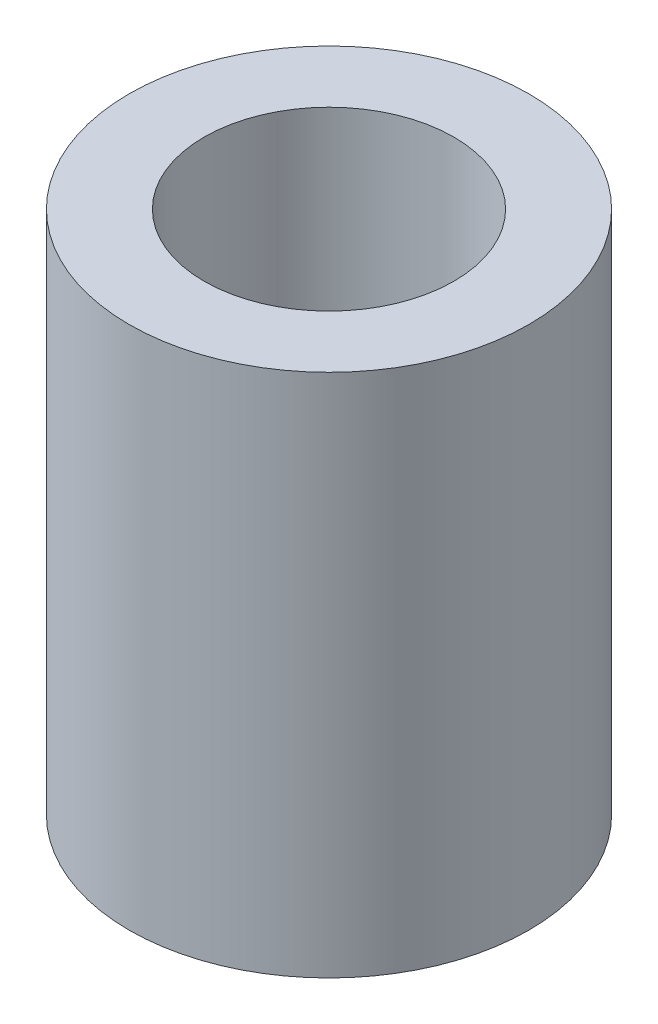
ISO-10303-21;
HEADER;
FILE_DESCRIPTION(('STEP AP214'),'2;1');
FILE_NAME('part.step','',(''),(''),'','','');
FILE_SCHEMA(('AUTOMOTIVE_DESIGN { 1 0 10303 214 1 1 1 1 }'));
ENDSEC;
DATA;
#1=APPLICATION_CONTEXT('core data for automotive mechanical design processes');
#2=APPLICATION_PROTOCOL_DEFINITION('international standard','automotive_design',2000,#1);
#3=PRODUCT_CONTEXT('',#1,'mechanical');
#4=PRODUCT('Part','Part','',(#3));
#5=PRODUCT_RELATED_PRODUCT_CATEGORY('part','',(#4));
#6=PRODUCT_DEFINITION_FORMATION('','',#4);
#7=PRODUCT_DEFINITION_CONTEXT('part definition',#1,'design');
#8=PRODUCT_DEFINITION('design','',#6,#7);
#9=PRODUCT_DEFINITION_SHAPE('','',#8);
#10=(LENGTH_UNIT() NAMED_UNIT(*) SI_UNIT(.MILLI.,.METRE.));
#11=(NAMED_UNIT(*) PLANE_ANGLE_UNIT() SI_UNIT($,.RADIAN.));
#12=(NAMED_UNIT(*) SI_UNIT($,.STERADIAN.) SOLID_ANGLE_UNIT());
#13=UNCERTAINTY_MEASURE_WITH_UNIT(LENGTH_MEASURE(1.E-05),#10,'distance_accuracy_value','');
#14=(GEOMETRIC_REPRESENTATION_CONTEXT(3) GLOBAL_UNCERTAINTY_ASSIGNED_CONTEXT((#13)) GLOBAL_UNIT_ASSIGNED_CONTEXT((#10,
#11,#12)) REPRESENTATION_CONTEXT('',''));
#15=CARTESIAN_POINT('',(0.,0.,0.));
#16=DIRECTION('',(0.,0.,1.));
#17=DIRECTION('',(1.,0.,0.));
#18=AXIS2_PLACEMENT_3D('',#15,#16,#17);
#19=CARTESIAN_POINT('',(0.,42.,0.));
#20=DIRECTION('',(0.,1.,0.));
#21=DIRECTION('',(0.,0.,1.));
#22=AXIS2_PLACEMENT_3D('',#19,#20,#21);
#23=PLANE('',#22);
#24=CARTESIAN_POINT('',(0.,42.,0.));
#25=DIRECTION('',(0.,1.,0.));
#26=DIRECTION('',(0.,0.,1.));
#27=AXIS2_PLACEMENT_3D('',#24,#25,#26);
#28=CIRCLE('',#27,16.);
#29=CARTESIAN_POINT('',(0.,42.,-16.));
#30=VERTEX_POINT('',#29);
#31=EDGE_CURVE('E10',#30,#30,#28,.T.);
#32=ORIENTED_EDGE('',*,*,#31,.T.);
#33=EDGE_LOOP('',(#32));
#34=FACE_BOUND('',#33,.T.);
#35=CARTESIAN_POINT('',(0.,42.,0.));
#36=DIRECTION('',(0.,1.,0.));
#37=DIRECTION('',(0.,0.,1.));
#38=AXIS2_PLACEMENT_3D('',#35,#36,#37);
#39=CIRCLE('',#38,10.);
#40=CARTESIAN_POINT('',(0.,42.,-10.));
#41=VERTEX_POINT('',#40);
#42=EDGE_CURVE('E41',#41,#41,#39,.T.);
#43=ORIENTED_EDGE('',*,*,#42,.F.);
#44=EDGE_LOOP('',(#43));
#45=FACE_BOUND('',#44,.T.);
#46=ADVANCED_FACE('F30',(#34,#45),#23,.T.);
#47=CARTESIAN_POINT('',(0.,0.,0.));
#48=DIRECTION('',(0.,1.,0.));
#49=DIRECTION('',(0.,0.,1.));
#50=AXIS2_PLACEMENT_3D('',#47,#48,#49);
#51=PLANE('',#50);
#52=CARTESIAN_POINT('',(0.,0.,0.));
#53=DIRECTION('',(0.,1.,0.));
#54=DIRECTION('',(0.,0.,1.));
#55=AXIS2_PLACEMENT_3D('',#52,#53,#54);
#56=CIRCLE('',#55,16.);
#57=CARTESIAN_POINT('',(0.,0.,-16.));
#58=VERTEX_POINT('',#57);
#59=EDGE_CURVE('E34',#58,#58,#56,.T.);
#60=ORIENTED_EDGE('',*,*,#59,.F.);
#61=EDGE_LOOP('',(#60));
#62=FACE_BOUND('',#61,.T.);
#63=CARTESIAN_POINT('',(0.,0.,0.));
#64=DIRECTION('',(0.,1.,0.));
#65=DIRECTION('',(0.,0.,1.));
#66=AXIS2_PLACEMENT_3D('',#63,#64,#65);
#67=CIRCLE('',#66,10.);
#68=CARTESIAN_POINT('',(0.,0.,-10.));
#69=VERTEX_POINT('',#68);
#70=EDGE_CURVE('E43',#69,#69,#67,.T.);
#71=ORIENTED_EDGE('',*,*,#70,.T.);
#72=EDGE_LOOP('',(#71));
#73=FACE_BOUND('',#72,.T.);
#74=ADVANCED_FACE('F53',(#62,#73),#51,.F.);
#75=CARTESIAN_POINT('',(0.,42.,0.));
#76=DIRECTION('',(0.,-1.,0.));
#77=DIRECTION('',(0.,0.,-1.));
#78=AXIS2_PLACEMENT_3D('',#75,#76,#77);
#79=CYLINDRICAL_SURFACE('',#78,16.);
#80=CARTESIAN_POINT('',(0.,42.,-16.));
#81=CARTESIAN_POINT('',(0.,41.5625,-16.));
#82=CARTESIAN_POINT('',(0.,41.125,-16.));
#83=CARTESIAN_POINT('',(0.,40.25,-16.));
#84=CARTESIAN_POINT('',(0.,39.8125,-16.));
#85=CARTESIAN_POINT('',(0.,38.9375,-16.));
#86=CARTESIAN_POINT('',(0.,38.5,-16.));
#87=CARTESIAN_POINT('',(0.,37.625,-16.));
#88=CARTESIAN_POINT('',(0.,37.1875,-16.));
#89=CARTESIAN_POINT('',(0.,36.3125,-16.));
#90=CARTESIAN_POINT('',(0.,35.875,-16.));
#91=CARTESIAN_POINT('',(0.,35.,-16.));
#92=CARTESIAN_POINT('',(0.,34.5625,-16.));
#93=CARTESIAN_POINT('',(0.,33.6875,-16.));
#94=CARTESIAN_POINT('',(0.,33.25,-16.));
#95=CARTESIAN_POINT('',(0.,32.375,-16.));
#96=CARTESIAN_POINT('',(0.,31.9375,-16.));
#97=CARTESIAN_POINT('',(0.,31.0625,-16.));
#98=CARTESIAN_POINT('',(0.,30.625,-16.));
#99=CARTESIAN_POINT('',(0.,29.75,-16.));
#100=CARTESIAN_POINT('',(0.,29.3125,-16.));
#101=CARTESIAN_POINT('',(0.,28.4375,-16.));
#102=CARTESIAN_POINT('',(0.,28.,-16.));
#103=CARTESIAN_POINT('',(0.,27.125,-16.));
#104=CARTESIAN_POINT('',(0.,26.6875,-16.));
#105=CARTESIAN_POINT('',(0.,25.8125,-16.));
#106=CARTESIAN_POINT('',(0.,25.375,-16.));
#107=CARTESIAN_POINT('',(0.,24.5,-16.));
#108=CARTESIAN_POINT('',(0.,24.0625,-16.));
#109=CARTESIAN_POINT('',(0.,23.1875,-16.));
#110=CARTESIAN_POINT('',(0.,22.75,-16.));
#111=CARTESIAN_POINT('',(0.,21.875,-16.));
#112=CARTESIAN_POINT('',(0.,21.4375,-16.));
#113=CARTESIAN_POINT('',(0.,20.5625,-16.));
#114=CARTESIAN_POINT('',(0.,20.125,-16.));
#115=CARTESIAN_POINT('',(0.,19.25,-16.));
#116=CARTESIAN_POINT('',(0.,18.8125,-16.));
#117=CARTESIAN_POINT('',(0.,17.9375,-16.));
#118=CARTESIAN_POINT('',(0.,17.5,-16.));
#119=CARTESIAN_POINT('',(0.,16.625,-16.));
#120=CARTESIAN_POINT('',(0.,16.1875,-16.));
#121=CARTESIAN_POINT('',(0.,15.3125,-16.));
#122=CARTESIAN_POINT('',(0.,14.875,-16.));
#123=CARTESIAN_POINT('',(0.,14.,-16.));
#124=CARTESIAN_POINT('',(0.,13.5625,-16.));
#125=CARTESIAN_POINT('',(0.,12.6875,-16.));
#126=CARTESIAN_POINT('',(0.,12.25,-16.));
#127=CARTESIAN_POINT('',(0.,11.375,-16.));
#128=CARTESIAN_POINT('',(0.,10.9375,-16.));
#129=CARTESIAN_POINT('',(0.,10.0625,-16.));
#130=CARTESIAN_POINT('',(0.,9.625,-16.));
#131=CARTESIAN_POINT('',(0.,8.75,-16.));
#132=CARTESIAN_POINT('',(0.,8.3125,-16.));
#133=CARTESIAN_POINT('',(0.,7.4375,-16.));
#134=CARTESIAN_POINT('',(0.,7.,-16.));
#135=CARTESIAN_POINT('',(0.,6.125,-16.));
#136=CARTESIAN_POINT('',(0.,5.6875,-16.));
#137=CARTESIAN_POINT('',(0.,4.8125,-16.));
#138=CARTESIAN_POINT('',(0.,4.375,-16.));
#139=CARTESIAN_POINT('',(0.,3.5,-16.));
#140=CARTESIAN_POINT('',(0.,3.0625,-16.));
#141=CARTESIAN_POINT('',(0.,2.1875,-16.));
#142=CARTESIAN_POINT('',(0.,1.75,-16.));
#143=CARTESIAN_POINT('',(0.,0.875000000000001,-16.));
#144=CARTESIAN_POINT('',(0.,0.4375,-16.));
#145=CARTESIAN_POINT('',(0.,0.,-16.));
#146=B_SPLINE_CURVE_WITH_KNOTS('',3,(#80,#81,#82,#83,#84,#85,#86,#87,#88,#89,#90,#91,#92,#93,
#94,#95,#96,#97,#98,#99,#100,#101,#102,#103,#104,#105,#106,#107,#108,#109,#110,#111,#112,#113,
#114,#115,#116,#117,#118,#119,#120,#121,#122,#123,#124,#125,#126,#127,#128,#129,#130,#131,#132,
#133,#134,#135,#136,#137,#138,#139,#140,#141,#142,#143,#144,#145),.UNSPECIFIED.,.F.,.F.,(4,2,2,
2,2,2,2,2,2,2,2,2,2,2,2,2,2,2,2,2,2,2,2,2,2,2,2,2,2,2,2,2,4),(0.,1.31249999999999,2.625,3.9375,
5.25,6.5625,7.87499999999999,9.18749999999999,10.5,11.8125,13.125,14.4375,15.75,17.0625,18.375,
19.6875,21.,22.3125,23.625,24.9375,26.25,27.5625,28.875,30.1875,31.5,32.8125,34.125,35.4375,
36.75,38.0625,39.375,40.6875,42.),.UNSPECIFIED.);
#147=EDGE_CURVE('BSEAM32',#30,#58,#146,.T.);
#148=ORIENTED_EDGE('',*,*,#31,.F.);
#149=ORIENTED_EDGE('',*,*,#59,.T.);
#150=ORIENTED_EDGE('',*,*,#147,.T.);
#151=ORIENTED_EDGE('',*,*,#147,.F.);
#152=EDGE_LOOP('',(#148,#150,#149,#151));
#153=FACE_BOUND('',#152,.T.);
#154=ADVANCED_FACE('F32',(#153),#79,.T.);
#155=CARTESIAN_POINT('',(0.,42.,0.));
#156=DIRECTION('',(0.,-1.,0.));
#157=DIRECTION('',(0.,0.,-1.));
#158=AXIS2_PLACEMENT_3D('',#155,#156,#157);
#159=CYLINDRICAL_SURFACE('',#158,10.);
#160=CARTESIAN_POINT('',(0.,42.,-10.));
#161=CARTESIAN_POINT('',(0.,41.5625,-10.));
#162=CARTESIAN_POINT('',(0.,41.125,-10.));
#163=CARTESIAN_POINT('',(0.,40.25,-10.));
#164=CARTESIAN_POINT('',(0.,39.8125,-10.));
#165=CARTESIAN_POINT('',(0.,38.9375,-10.));
#166=CARTESIAN_POINT('',(0.,38.5,-10.));
#167=CARTESIAN_POINT('',(0.,37.625,-10.));
#168=CARTESIAN_POINT('',(0.,37.1875,-10.));
#169=CARTESIAN_POINT('',(0.,36.3125,-10.));
#170=CARTESIAN_POINT('',(0.,35.875,-10.));
#171=CARTESIAN_POINT('',(0.,35.,-10.));
#172=CARTESIAN_POINT('',(0.,34.5625,-10.));
#173=CARTESIAN_POINT('',(0.,33.6875,-10.));
#174=CARTESIAN_POINT('',(0.,33.25,-10.));
#175=CARTESIAN_POINT('',(0.,32.375,-10.));
#176=CARTESIAN_POINT('',(0.,31.9375,-10.));
#177=CARTESIAN_POINT('',(0.,31.0625,-10.));
#178=CARTESIAN_POINT('',(0.,30.625,-10.));
#179=CARTESIAN_POINT('',(0.,29.75,-10.));
#180=CARTESIAN_POINT('',(0.,29.3125,-10.));
#181=CARTESIAN_POINT('',(0.,28.4375,-10.));
#182=CARTESIAN_POINT('',(0.,28.,-10.));
#183=CARTESIAN_POINT('',(0.,27.125,-10.));
#184=CARTESIAN_POINT('',(0.,26.6875,-10.));
#185=CARTESIAN_POINT('',(0.,25.8125,-10.));
#186=CARTESIAN_POINT('',(0.,25.375,-10.));
#187=CARTESIAN_POINT('',(0.,24.5,-10.));
#188=CARTESIAN_POINT('',(0.,24.0625,-10.));
#189=CARTESIAN_POINT('',(0.,23.1875,-10.));
#190=CARTESIAN_POINT('',(0.,22.75,-10.));
#191=CARTESIAN_POINT('',(0.,21.875,-10.));
#192=CARTESIAN_POINT('',(0.,21.4375,-10.));
#193=CARTESIAN_POINT('',(0.,20.5625,-10.));
#194=CARTESIAN_POINT('',(0.,20.125,-10.));
#195=CARTESIAN_POINT('',(0.,19.25,-10.));
#196=CARTESIAN_POINT('',(0.,18.8125,-10.));
#197=CARTESIAN_POINT('',(0.,17.9375,-10.));
#198=CARTESIAN_POINT('',(0.,17.5,-10.));
#199=CARTESIAN_POINT('',(0.,16.625,-10.));
#200=CARTESIAN_POINT('',(0.,16.1875,-10.));
#201=CARTESIAN_POINT('',(0.,15.3125,-10.));
#202=CARTESIAN_POINT('',(0.,14.875,-10.));
#203=CARTESIAN_POINT('',(0.,14.,-10.));
#204=CARTESIAN_POINT('',(0.,13.5625,-10.));
#205=CARTESIAN_POINT('',(0.,12.6875,-10.));
#206=CARTESIAN_POINT('',(0.,12.25,-10.));
#207=CARTESIAN_POINT('',(0.,11.375,-10.));
#208=CARTESIAN_POINT('',(0.,10.9375,-10.));
#209=CARTESIAN_POINT('',(0.,10.0625,-10.));
#210=CARTESIAN_POINT('',(0.,9.625,-10.));
#211=CARTESIAN_POINT('',(0.,8.75,-10.));
#212=CARTESIAN_POINT('',(0.,8.3125,-10.));
#213=CARTESIAN_POINT('',(0.,7.4375,-10.));
#214=CARTESIAN_POINT('',(0.,7.,-10.));
#215=CARTESIAN_POINT('',(0.,6.125,-10.));
#216=CARTESIAN_POINT('',(0.,5.6875,-10.));
#217=CARTESIAN_POINT('',(0.,4.8125,-10.));
#218=CARTESIAN_POINT('',(0.,4.375,-10.));
#219=CARTESIAN_POINT('',(0.,3.5,-10.));
#220=CARTESIAN_POINT('',(0.,3.0625,-10.));
#221=CARTESIAN_POINT('',(0.,2.1875,-10.));
#222=CARTESIAN_POINT('',(0.,1.75,-10.));
#223=CARTESIAN_POINT('',(0.,0.875000000000001,-10.));
#224=CARTESIAN_POINT('',(0.,0.4375,-10.));
#225=CARTESIAN_POINT('',(0.,0.,-10.));
#226=B_SPLINE_CURVE_WITH_KNOTS('',3,(#160,#161,#162,#163,#164,#165,#166,#167,#168,#169,#170,
#171,#172,#173,#174,#175,#176,#177,#178,#179,#180,#181,#182,#183,#184,#185,#186,#187,#188,#189,
#190,#191,#192,#193,#194,#195,#196,#197,#198,#199,#200,#201,#202,#203,#204,#205,#206,#207,#208,
#209,#210,#211,#212,#213,#214,#215,#216,#217,#218,#219,#220,#221,#222,#223,#224,#225),
.UNSPECIFIED.,.F.,.F.,(4,2,2,2,2,2,2,2,2,2,2,2,2,2,2,2,2,2,2,2,2,2,2,2,2,2,2,2,2,2,2,2,4),(0.,
1.3125,2.625,3.9375,5.25,6.56250000000001,7.875,9.1875,10.5,11.8125,13.125,14.4375,15.75,
17.0625,18.375,19.6875,21.,22.3125,23.625,24.9375,26.25,27.5625,28.875,30.1875,31.5,32.8125,
34.125,35.4375,36.75,38.0625,39.375,40.6875,42.),.UNSPECIFIED.);
#227=EDGE_CURVE('BSEAM49',#41,#69,#226,.T.);
#228=ORIENTED_EDGE('',*,*,#42,.T.);
#229=ORIENTED_EDGE('',*,*,#70,.F.);
#230=ORIENTED_EDGE('',*,*,#227,.T.);
#231=ORIENTED_EDGE('',*,*,#227,.F.);
#232=EDGE_LOOP('',(#228,#230,#229,#231));
#233=FACE_BOUND('',#232,.T.);
#234=ADVANCED_FACE('F49',(#233),#159,.F.);
#235=CLOSED_SHELL('',(#46,#74,#154,#234));
#236=MANIFOLD_SOLID_BREP('B2',#235);
#237=ADVANCED_BREP_SHAPE_REPRESENTATION('',(#18,#236),#14);
#238=SHAPE_DEFINITION_REPRESENTATION(#9,#237);
ENDSEC;
END-ISO-10303-21;
